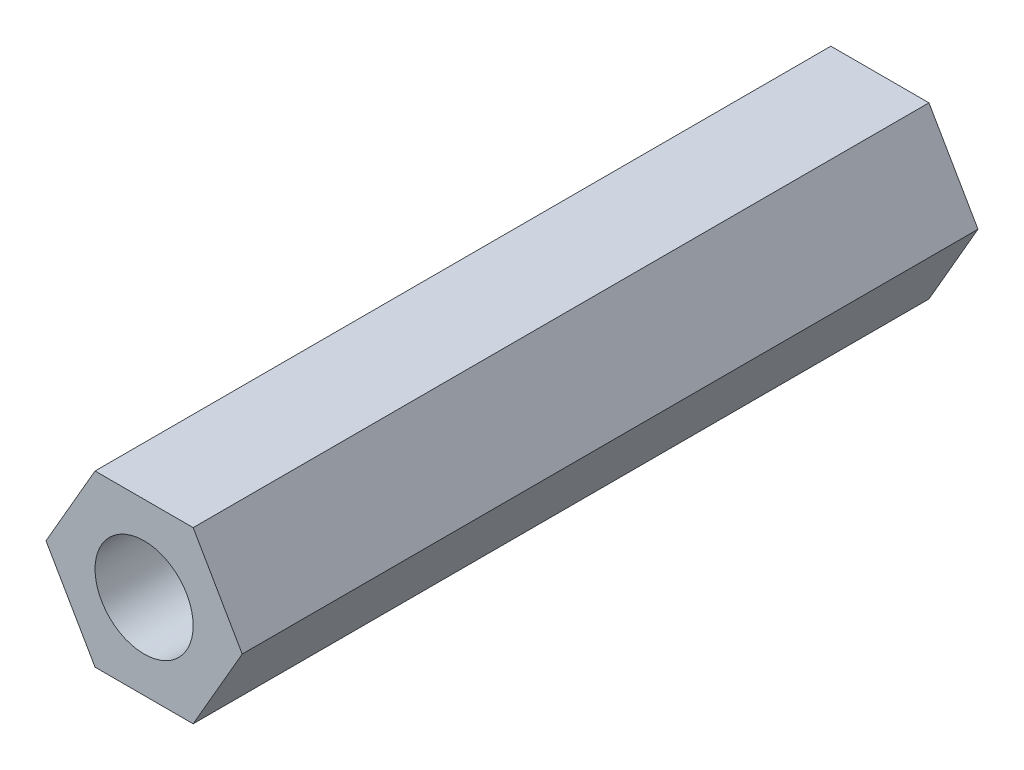
ISO-10303-21;
HEADER;
FILE_DESCRIPTION(('STEP AP214'),'2;1');
FILE_NAME('part.step','',(''),(''),'','','');
FILE_SCHEMA(('AUTOMOTIVE_DESIGN { 1 0 10303 214 1 1 1 1 }'));
ENDSEC;
DATA;
#1=APPLICATION_CONTEXT('core data for automotive mechanical design processes');
#2=APPLICATION_PROTOCOL_DEFINITION('international standard','automotive_design',2000,#1);
#3=PRODUCT_CONTEXT('',#1,'mechanical');
#4=PRODUCT('Part','Part','',(#3));
#5=PRODUCT_RELATED_PRODUCT_CATEGORY('part','',(#4));
#6=PRODUCT_DEFINITION_FORMATION('','',#4);
#7=PRODUCT_DEFINITION_CONTEXT('part definition',#1,'design');
#8=PRODUCT_DEFINITION('design','',#6,#7);
#9=PRODUCT_DEFINITION_SHAPE('','',#8);
#10=(LENGTH_UNIT() NAMED_UNIT(*) SI_UNIT(.MILLI.,.METRE.));
#11=(NAMED_UNIT(*) PLANE_ANGLE_UNIT() SI_UNIT($,.RADIAN.));
#12=(NAMED_UNIT(*) SI_UNIT($,.STERADIAN.) SOLID_ANGLE_UNIT());
#13=UNCERTAINTY_MEASURE_WITH_UNIT(LENGTH_MEASURE(1.E-05),#10,'distance_accuracy_value','');
#14=(GEOMETRIC_REPRESENTATION_CONTEXT(3) GLOBAL_UNCERTAINTY_ASSIGNED_CONTEXT((#13)) GLOBAL_UNIT_ASSIGNED_CONTEXT((#10,
#11,#12)) REPRESENTATION_CONTEXT('',''));
#15=CARTESIAN_POINT('',(0.,0.,0.));
#16=DIRECTION('',(0.,0.,1.));
#17=DIRECTION('',(1.,0.,0.));
#18=AXIS2_PLACEMENT_3D('',#15,#16,#17);
#19=CARTESIAN_POINT('',(0.,0.,30.));
#20=DIRECTION('',(0.,0.,1.));
#21=DIRECTION('',(1.,0.,0.));
#22=AXIS2_PLACEMENT_3D('',#19,#20,#21);
#23=PLANE('',#22);
#24=DIRECTION('',(-1.,0.,0.));
#25=VECTOR('',#24,1.);
#26=CARTESIAN_POINT('',(2.,3.46410161513775,30.));
#27=LINE('',#26,#25);
#28=CARTESIAN_POINT('',(2.,3.46410161513775,30.));
#29=VERTEX_POINT('',#28);
#30=CARTESIAN_POINT('',(-2.,3.46410161513775,30.));
#31=VERTEX_POINT('',#30);
#32=EDGE_CURVE('E146',#29,#31,#27,.T.);
#33=ORIENTED_EDGE('',*,*,#32,.T.);
#34=DIRECTION('',(-0.5,-0.866025403784439,0.));
#35=VECTOR('',#34,1.);
#36=CARTESIAN_POINT('',(-2.,3.46410161513775,30.));
#37=LINE('',#36,#35);
#38=CARTESIAN_POINT('',(-4.,0.,30.));
#39=VERTEX_POINT('',#38);
#40=EDGE_CURVE('E94',#31,#39,#37,.T.);
#41=ORIENTED_EDGE('',*,*,#40,.T.);
#42=DIRECTION('',(0.5,-0.866025403784439,0.));
#43=VECTOR('',#42,1.);
#44=CARTESIAN_POINT('',(-4.,0.,30.));
#45=LINE('',#44,#43);
#46=CARTESIAN_POINT('',(-2.,-3.46410161513775,30.));
#47=VERTEX_POINT('',#46);
#48=EDGE_CURVE('E107',#39,#47,#45,.T.);
#49=ORIENTED_EDGE('',*,*,#48,.T.);
#50=DIRECTION('',(1.,0.,0.));
#51=VECTOR('',#50,1.);
#52=CARTESIAN_POINT('',(-2.,-3.46410161513775,30.));
#53=LINE('',#52,#51);
#54=CARTESIAN_POINT('',(2.,-3.46410161513775,30.));
#55=VERTEX_POINT('',#54);
#56=EDGE_CURVE('E101',#47,#55,#53,.T.);
#57=ORIENTED_EDGE('',*,*,#56,.T.);
#58=DIRECTION('',(0.5,0.866025403784439,0.));
#59=VECTOR('',#58,1.);
#60=CARTESIAN_POINT('',(2.,-3.46410161513775,30.));
#61=LINE('',#60,#59);
#62=CARTESIAN_POINT('',(4.,0.,30.));
#63=VERTEX_POINT('',#62);
#64=EDGE_CURVE('E105',#55,#63,#61,.T.);
#65=ORIENTED_EDGE('',*,*,#64,.T.);
#66=DIRECTION('',(-0.5,0.866025403784439,0.));
#67=VECTOR('',#66,1.);
#68=CARTESIAN_POINT('',(4.,0.,30.));
#69=LINE('',#68,#67);
#70=EDGE_CURVE('E57',#63,#29,#69,.T.);
#71=ORIENTED_EDGE('',*,*,#70,.T.);
#72=EDGE_LOOP('',(#33,#41,#49,#57,#65,#71));
#73=FACE_BOUND('',#72,.T.);
#74=CARTESIAN_POINT('',(0.,0.,30.));
#75=DIRECTION('',(0.,0.,1.));
#76=DIRECTION('',(1.,0.,0.));
#77=AXIS2_PLACEMENT_3D('',#74,#75,#76);
#78=CIRCLE('',#77,2.);
#79=CARTESIAN_POINT('',(2.,0.,30.));
#80=VERTEX_POINT('',#79);
#81=EDGE_CURVE('E134',#80,#80,#78,.T.);
#82=ORIENTED_EDGE('',*,*,#81,.F.);
#83=EDGE_LOOP('',(#82));
#84=FACE_BOUND('',#83,.T.);
#85=ADVANCED_FACE('F39',(#73,#84),#23,.T.);
#86=CARTESIAN_POINT('',(0.,0.,0.));
#87=DIRECTION('',(0.,0.,1.));
#88=DIRECTION('',(1.,0.,0.));
#89=AXIS2_PLACEMENT_3D('',#86,#87,#88);
#90=PLANE('',#89);
#91=DIRECTION('',(-1.,0.,0.));
#92=VECTOR('',#91,1.);
#93=CARTESIAN_POINT('',(2.,3.46410161513775,0.));
#94=LINE('',#93,#92);
#95=CARTESIAN_POINT('',(2.,3.46410161513775,0.));
#96=VERTEX_POINT('',#95);
#97=CARTESIAN_POINT('',(-2.,3.46410161513775,0.));
#98=VERTEX_POINT('',#97);
#99=EDGE_CURVE('E129',#96,#98,#94,.T.);
#100=ORIENTED_EDGE('',*,*,#99,.F.);
#101=DIRECTION('',(-0.5,0.866025403784439,0.));
#102=VECTOR('',#101,1.);
#103=CARTESIAN_POINT('',(4.,0.,0.));
#104=LINE('',#103,#102);
#105=CARTESIAN_POINT('',(4.,0.,0.));
#106=VERTEX_POINT('',#105);
#107=EDGE_CURVE('E86',#106,#96,#104,.T.);
#108=ORIENTED_EDGE('',*,*,#107,.F.);
#109=DIRECTION('',(0.5,0.866025403784439,0.));
#110=VECTOR('',#109,1.);
#111=CARTESIAN_POINT('',(2.,-3.46410161513775,0.));
#112=LINE('',#111,#110);
#113=CARTESIAN_POINT('',(2.,-3.46410161513775,0.));
#114=VERTEX_POINT('',#113);
#115=EDGE_CURVE('E80',#114,#106,#112,.T.);
#116=ORIENTED_EDGE('',*,*,#115,.F.);
#117=DIRECTION('',(1.,0.,0.));
#118=VECTOR('',#117,1.);
#119=CARTESIAN_POINT('',(-2.,-3.46410161513775,0.));
#120=LINE('',#119,#118);
#121=CARTESIAN_POINT('',(-2.,-3.46410161513775,0.));
#122=VERTEX_POINT('',#121);
#123=EDGE_CURVE('E116',#122,#114,#120,.T.);
#124=ORIENTED_EDGE('',*,*,#123,.F.);
#125=DIRECTION('',(0.5,-0.866025403784439,0.));
#126=VECTOR('',#125,1.);
#127=CARTESIAN_POINT('',(-4.,0.,0.));
#128=LINE('',#127,#126);
#129=CARTESIAN_POINT('',(-4.,0.,0.));
#130=VERTEX_POINT('',#129);
#131=EDGE_CURVE('E137',#130,#122,#128,.T.);
#132=ORIENTED_EDGE('',*,*,#131,.F.);
#133=DIRECTION('',(-0.5,-0.866025403784439,0.));
#134=VECTOR('',#133,1.);
#135=CARTESIAN_POINT('',(-2.,3.46410161513775,0.));
#136=LINE('',#135,#134);
#137=EDGE_CURVE('E133',#98,#130,#136,.T.);
#138=ORIENTED_EDGE('',*,*,#137,.F.);
#139=EDGE_LOOP('',(#100,#108,#116,#124,#132,#138));
#140=FACE_BOUND('',#139,.T.);
#141=CARTESIAN_POINT('',(0.,0.,0.));
#142=DIRECTION('',(0.,0.,1.));
#143=DIRECTION('',(1.,0.,0.));
#144=AXIS2_PLACEMENT_3D('',#141,#142,#143);
#145=CIRCLE('',#144,2.);
#146=CARTESIAN_POINT('',(2.,0.,0.));
#147=VERTEX_POINT('',#146);
#148=EDGE_CURVE('E243',#147,#147,#145,.T.);
#149=ORIENTED_EDGE('',*,*,#148,.T.);
#150=EDGE_LOOP('',(#149));
#151=FACE_BOUND('',#150,.T.);
#152=ADVANCED_FACE('F159',(#140,#151),#90,.F.);
#153=CARTESIAN_POINT('',(2.,3.46410161513775,30.));
#154=DIRECTION('',(0.,-1.,0.));
#155=DIRECTION('',(1.,0.,0.));
#156=AXIS2_PLACEMENT_3D('',#153,#154,#155);
#157=PLANE('',#156);
#158=ORIENTED_EDGE('',*,*,#99,.T.);
#159=DIRECTION('',(0.,0.,-1.));
#160=VECTOR('',#159,1.);
#161=CARTESIAN_POINT('',(-2.,3.46410161513775,30.));
#162=LINE('',#161,#160);
#163=EDGE_CURVE('E11',#31,#98,#162,.T.);
#164=ORIENTED_EDGE('',*,*,#163,.F.);
#165=ORIENTED_EDGE('',*,*,#32,.F.);
#166=DIRECTION('',(0.,0.,-1.));
#167=VECTOR('',#166,1.);
#168=CARTESIAN_POINT('',(2.,3.46410161513775,30.));
#169=LINE('',#168,#167);
#170=EDGE_CURVE('E125',#29,#96,#169,.T.);
#171=ORIENTED_EDGE('',*,*,#170,.T.);
#172=EDGE_LOOP('',(#158,#164,#165,#171));
#173=FACE_BOUND('',#172,.T.);
#174=ADVANCED_FACE('F41',(#173),#157,.F.);
#175=CARTESIAN_POINT('',(-2.,3.46410161513775,30.));
#176=DIRECTION('',(0.866025403784438,-0.5,0.));
#177=DIRECTION('',(0.5,0.866025403784439,0.));
#178=AXIS2_PLACEMENT_3D('',#175,#176,#177);
#179=PLANE('',#178);
#180=ORIENTED_EDGE('',*,*,#137,.T.);
#181=DIRECTION('',(0.,0.,-1.));
#182=VECTOR('',#181,1.);
#183=CARTESIAN_POINT('',(-4.,0.,30.));
#184=LINE('',#183,#182);
#185=EDGE_CURVE('E49',#39,#130,#184,.T.);
#186=ORIENTED_EDGE('',*,*,#185,.F.);
#187=ORIENTED_EDGE('',*,*,#40,.F.);
#188=ORIENTED_EDGE('',*,*,#163,.T.);
#189=EDGE_LOOP('',(#180,#186,#187,#188));
#190=FACE_BOUND('',#189,.T.);
#191=ADVANCED_FACE('F184',(#190),#179,.F.);
#192=CARTESIAN_POINT('',(-4.,0.,30.));
#193=DIRECTION('',(0.866025403784439,0.5,0.));
#194=DIRECTION('',(-0.5,0.866025403784439,0.));
#195=AXIS2_PLACEMENT_3D('',#192,#193,#194);
#196=PLANE('',#195);
#197=ORIENTED_EDGE('',*,*,#131,.T.);
#198=DIRECTION('',(0.,0.,-1.));
#199=VECTOR('',#198,1.);
#200=CARTESIAN_POINT('',(-2.,-3.46410161513775,30.));
#201=LINE('',#200,#199);
#202=EDGE_CURVE('E118',#47,#122,#201,.T.);
#203=ORIENTED_EDGE('',*,*,#202,.F.);
#204=ORIENTED_EDGE('',*,*,#48,.F.);
#205=ORIENTED_EDGE('',*,*,#185,.T.);
#206=EDGE_LOOP('',(#197,#203,#204,#205));
#207=FACE_BOUND('',#206,.T.);
#208=ADVANCED_FACE('F156',(#207),#196,.F.);
#209=CARTESIAN_POINT('',(-2.,-3.46410161513775,30.));
#210=DIRECTION('',(0.,1.,0.));
#211=DIRECTION('',(-1.,0.,0.));
#212=AXIS2_PLACEMENT_3D('',#209,#210,#211);
#213=PLANE('',#212);
#214=ORIENTED_EDGE('',*,*,#123,.T.);
#215=DIRECTION('',(0.,0.,-1.));
#216=VECTOR('',#215,1.);
#217=CARTESIAN_POINT('',(2.,-3.46410161513775,30.));
#218=LINE('',#217,#216);
#219=EDGE_CURVE('E113',#55,#114,#218,.T.);
#220=ORIENTED_EDGE('',*,*,#219,.F.);
#221=ORIENTED_EDGE('',*,*,#56,.F.);
#222=ORIENTED_EDGE('',*,*,#202,.T.);
#223=EDGE_LOOP('',(#214,#220,#221,#222));
#224=FACE_BOUND('',#223,.T.);
#225=ADVANCED_FACE('F114',(#224),#213,.F.);
#226=CARTESIAN_POINT('',(2.,-3.46410161513775,30.));
#227=DIRECTION('',(-0.866025403784438,0.5,0.));
#228=DIRECTION('',(-0.5,-0.866025403784439,0.));
#229=AXIS2_PLACEMENT_3D('',#226,#227,#228);
#230=PLANE('',#229);
#231=ORIENTED_EDGE('',*,*,#115,.T.);
#232=DIRECTION('',(0.,0.,-1.));
#233=VECTOR('',#232,1.);
#234=CARTESIAN_POINT('',(4.,0.,30.));
#235=LINE('',#234,#233);
#236=EDGE_CURVE('E119',#63,#106,#235,.T.);
#237=ORIENTED_EDGE('',*,*,#236,.F.);
#238=ORIENTED_EDGE('',*,*,#64,.F.);
#239=ORIENTED_EDGE('',*,*,#219,.T.);
#240=EDGE_LOOP('',(#231,#237,#238,#239));
#241=FACE_BOUND('',#240,.T.);
#242=ADVANCED_FACE('F121',(#241),#230,.F.);
#243=CARTESIAN_POINT('',(4.,0.,30.));
#244=DIRECTION('',(-0.866025403784439,-0.5,0.));
#245=DIRECTION('',(0.5,-0.866025403784439,0.));
#246=AXIS2_PLACEMENT_3D('',#243,#244,#245);
#247=PLANE('',#246);
#248=ORIENTED_EDGE('',*,*,#107,.T.);
#249=ORIENTED_EDGE('',*,*,#170,.F.);
#250=ORIENTED_EDGE('',*,*,#70,.F.);
#251=ORIENTED_EDGE('',*,*,#236,.T.);
#252=EDGE_LOOP('',(#248,#249,#250,#251));
#253=FACE_BOUND('',#252,.T.);
#254=ADVANCED_FACE('F164',(#253),#247,.F.);
#255=CARTESIAN_POINT('',(0.,0.,30.));
#256=DIRECTION('',(0.,0.,-1.));
#257=DIRECTION('',(-1.,0.,0.));
#258=AXIS2_PLACEMENT_3D('',#255,#256,#257);
#259=CYLINDRICAL_SURFACE('',#258,2.);
#260=ORIENTED_EDGE('',*,*,#81,.T.);
#261=EDGE_LOOP('',(#260));
#262=FACE_BOUND('',#261,.T.);
#263=ORIENTED_EDGE('',*,*,#148,.F.);
#264=EDGE_LOOP('',(#263));
#265=FACE_BOUND('',#264,.T.);
#266=ADVANCED_FACE('F166',(#262,#265),#259,.F.);
#267=CLOSED_SHELL('',(#85,#152,#174,#191,#208,#225,#242,#254,#266));
#268=MANIFOLD_SOLID_BREP('B2',#267);
#269=ADVANCED_BREP_SHAPE_REPRESENTATION('',(#18,#268),#14);
#270=SHAPE_DEFINITION_REPRESENTATION(#9,#269);
ENDSEC;
END-ISO-10303-21;
